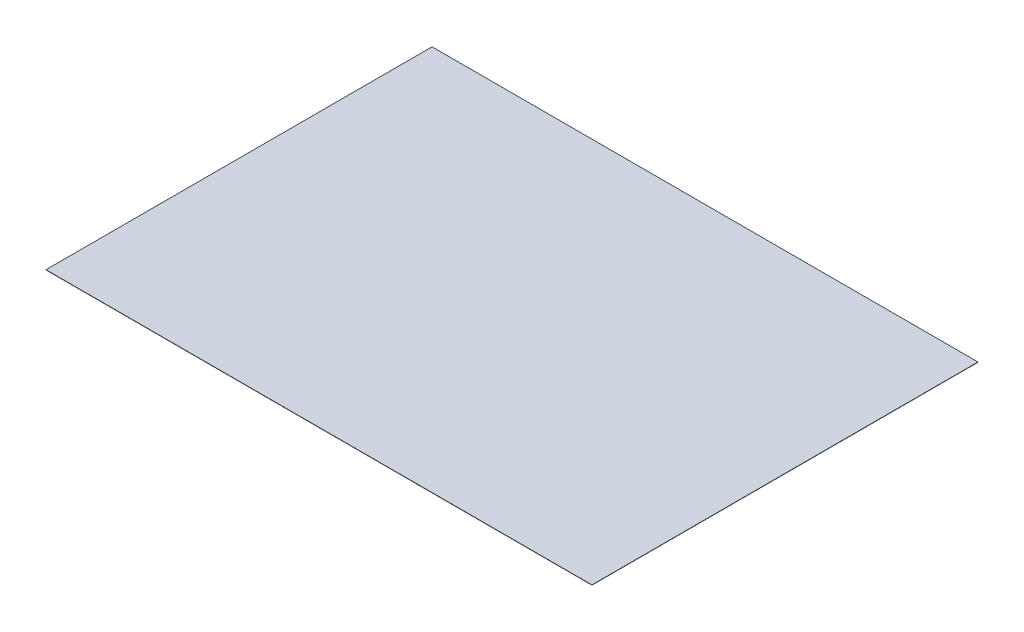
ISO-10303-21;
HEADER;
FILE_DESCRIPTION(('STEP AP214'),'2;1');
FILE_NAME('part.step','',(''),(''),'','','');
FILE_SCHEMA(('AUTOMOTIVE_DESIGN { 1 0 10303 214 1 1 1 1 }'));
ENDSEC;
DATA;
#1=APPLICATION_CONTEXT('core data for automotive mechanical design processes');
#2=APPLICATION_PROTOCOL_DEFINITION('international standard','automotive_design',2000,#1);
#3=PRODUCT_CONTEXT('',#1,'mechanical');
#4=PRODUCT('Part','Part','',(#3));
#5=PRODUCT_RELATED_PRODUCT_CATEGORY('part','',(#4));
#6=PRODUCT_DEFINITION_FORMATION('','',#4);
#7=PRODUCT_DEFINITION_CONTEXT('part definition',#1,'design');
#8=PRODUCT_DEFINITION('design','',#6,#7);
#9=PRODUCT_DEFINITION_SHAPE('','',#8);
#10=(LENGTH_UNIT() NAMED_UNIT(*) SI_UNIT(.MILLI.,.METRE.));
#11=(NAMED_UNIT(*) PLANE_ANGLE_UNIT() SI_UNIT($,.RADIAN.));
#12=(NAMED_UNIT(*) SI_UNIT($,.STERADIAN.) SOLID_ANGLE_UNIT());
#13=UNCERTAINTY_MEASURE_WITH_UNIT(LENGTH_MEASURE(1.E-05),#10,'distance_accuracy_value','');
#14=(GEOMETRIC_REPRESENTATION_CONTEXT(3) GLOBAL_UNCERTAINTY_ASSIGNED_CONTEXT((#13)) GLOBAL_UNIT_ASSIGNED_CONTEXT((#10,
#11,#12)) REPRESENTATION_CONTEXT('',''));
#15=CARTESIAN_POINT('',(0.,0.,0.));
#16=DIRECTION('',(0.,0.,1.));
#17=DIRECTION('',(1.,0.,0.));
#18=AXIS2_PLACEMENT_3D('',#15,#16,#17);
#19=CARTESIAN_POINT('',(210.,0.2,-148.5));
#20=DIRECTION('',(-1.,0.,0.));
#21=DIRECTION('',(0.,0.,1.));
#22=AXIS2_PLACEMENT_3D('',#19,#20,#21);
#23=PLANE('',#22);
#24=DIRECTION('',(0.,0.,-1.));
#25=VECTOR('',#24,1.);
#26=CARTESIAN_POINT('',(210.,0.,-148.5));
#27=LINE('',#26,#25);
#28=CARTESIAN_POINT('',(210.,0.,148.5));
#29=VERTEX_POINT('',#28);
#30=CARTESIAN_POINT('',(210.,0.,-148.5));
#31=VERTEX_POINT('',#30);
#32=EDGE_CURVE('E111',#29,#31,#27,.T.);
#33=ORIENTED_EDGE('',*,*,#32,.T.);
#34=DIRECTION('',(0.,-1.,0.));
#35=VECTOR('',#34,1.);
#36=CARTESIAN_POINT('',(210.,0.2,-148.5));
#37=LINE('',#36,#35);
#38=CARTESIAN_POINT('',(210.,0.2,-148.5));
#39=VERTEX_POINT('',#38);
#40=EDGE_CURVE('E11',#39,#31,#37,.T.);
#41=ORIENTED_EDGE('',*,*,#40,.F.);
#42=DIRECTION('',(0.,0.,-1.));
#43=VECTOR('',#42,1.);
#44=CARTESIAN_POINT('',(210.,0.2,-148.5));
#45=LINE('',#44,#43);
#46=CARTESIAN_POINT('',(210.,0.2,148.5));
#47=VERTEX_POINT('',#46);
#48=EDGE_CURVE('E95',#47,#39,#45,.T.);
#49=ORIENTED_EDGE('',*,*,#48,.F.);
#50=DIRECTION('',(0.,-1.,0.));
#51=VECTOR('',#50,1.);
#52=CARTESIAN_POINT('',(210.,0.2,148.5));
#53=LINE('',#52,#51);
#54=EDGE_CURVE('E107',#47,#29,#53,.T.);
#55=ORIENTED_EDGE('',*,*,#54,.T.);
#56=EDGE_LOOP('',(#33,#41,#49,#55));
#57=FACE_BOUND('',#56,.T.);
#58=ADVANCED_FACE('F43',(#57),#23,.F.);
#59=CARTESIAN_POINT('',(-210.,0.2,-148.5));
#60=DIRECTION('',(0.,0.,1.));
#61=DIRECTION('',(1.,0.,0.));
#62=AXIS2_PLACEMENT_3D('',#59,#60,#61);
#63=PLANE('',#62);
#64=DIRECTION('',(-1.,0.,0.));
#65=VECTOR('',#64,1.);
#66=CARTESIAN_POINT('',(-210.,0.,-148.5));
#67=LINE('',#66,#65);
#68=CARTESIAN_POINT('',(-210.,0.,-148.5));
#69=VERTEX_POINT('',#68);
#70=EDGE_CURVE('E100',#31,#69,#67,.T.);
#71=ORIENTED_EDGE('',*,*,#70,.T.);
#72=DIRECTION('',(0.,-1.,0.));
#73=VECTOR('',#72,1.);
#74=CARTESIAN_POINT('',(-210.,0.2,-148.5));
#75=LINE('',#74,#73);
#76=CARTESIAN_POINT('',(-210.,0.2,-148.5));
#77=VERTEX_POINT('',#76);
#78=EDGE_CURVE('E52',#77,#69,#75,.T.);
#79=ORIENTED_EDGE('',*,*,#78,.F.);
#80=DIRECTION('',(-1.,0.,0.));
#81=VECTOR('',#80,1.);
#82=CARTESIAN_POINT('',(-210.,0.2,-148.5));
#83=LINE('',#82,#81);
#84=EDGE_CURVE('E90',#39,#77,#83,.T.);
#85=ORIENTED_EDGE('',*,*,#84,.F.);
#86=ORIENTED_EDGE('',*,*,#40,.T.);
#87=EDGE_LOOP('',(#71,#79,#85,#86));
#88=FACE_BOUND('',#87,.T.);
#89=ADVANCED_FACE('F99',(#88),#63,.F.);
#90=CARTESIAN_POINT('',(-210.,0.2,-148.5));
#91=DIRECTION('',(1.,0.,0.));
#92=DIRECTION('',(0.,0.,-1.));
#93=AXIS2_PLACEMENT_3D('',#90,#91,#92);
#94=PLANE('',#93);
#95=DIRECTION('',(0.,0.,1.));
#96=VECTOR('',#95,1.);
#97=CARTESIAN_POINT('',(-210.,0.,-148.5));
#98=LINE('',#97,#96);
#99=CARTESIAN_POINT('',(-210.,0.,148.5));
#100=VERTEX_POINT('',#99);
#101=EDGE_CURVE('E77',#69,#100,#98,.T.);
#102=ORIENTED_EDGE('',*,*,#101,.T.);
#103=DIRECTION('',(0.,-1.,0.));
#104=VECTOR('',#103,1.);
#105=CARTESIAN_POINT('',(-210.,0.2,148.5));
#106=LINE('',#105,#104);
#107=CARTESIAN_POINT('',(-210.,0.2,148.5));
#108=VERTEX_POINT('',#107);
#109=EDGE_CURVE('E102',#108,#100,#106,.T.);
#110=ORIENTED_EDGE('',*,*,#109,.F.);
#111=DIRECTION('',(0.,0.,1.));
#112=VECTOR('',#111,1.);
#113=CARTESIAN_POINT('',(-210.,0.2,-148.5));
#114=LINE('',#113,#112);
#115=EDGE_CURVE('E93',#77,#108,#114,.T.);
#116=ORIENTED_EDGE('',*,*,#115,.F.);
#117=ORIENTED_EDGE('',*,*,#78,.T.);
#118=EDGE_LOOP('',(#102,#110,#116,#117));
#119=FACE_BOUND('',#118,.T.);
#120=ADVANCED_FACE('F103',(#119),#94,.F.);
#121=CARTESIAN_POINT('',(-210.,0.2,148.5));
#122=DIRECTION('',(0.,0.,-1.));
#123=DIRECTION('',(-1.,0.,0.));
#124=AXIS2_PLACEMENT_3D('',#121,#122,#123);
#125=PLANE('',#124);
#126=DIRECTION('',(1.,0.,0.));
#127=VECTOR('',#126,1.);
#128=CARTESIAN_POINT('',(-210.,0.,148.5));
#129=LINE('',#128,#127);
#130=EDGE_CURVE('E83',#100,#29,#129,.T.);
#131=ORIENTED_EDGE('',*,*,#130,.T.);
#132=ORIENTED_EDGE('',*,*,#54,.F.);
#133=DIRECTION('',(1.,0.,0.));
#134=VECTOR('',#133,1.);
#135=CARTESIAN_POINT('',(-210.,0.2,148.5));
#136=LINE('',#135,#134);
#137=EDGE_CURVE('E60',#108,#47,#136,.T.);
#138=ORIENTED_EDGE('',*,*,#137,.F.);
#139=ORIENTED_EDGE('',*,*,#109,.T.);
#140=EDGE_LOOP('',(#131,#132,#138,#139));
#141=FACE_BOUND('',#140,.T.);
#142=ADVANCED_FACE('F124',(#141),#125,.F.);
#143=CARTESIAN_POINT('',(0.,0.2,0.));
#144=DIRECTION('',(0.,1.,0.));
#145=DIRECTION('',(0.,0.,1.));
#146=AXIS2_PLACEMENT_3D('',#143,#144,#145);
#147=PLANE('',#146);
#148=ORIENTED_EDGE('',*,*,#48,.T.);
#149=ORIENTED_EDGE('',*,*,#84,.T.);
#150=ORIENTED_EDGE('',*,*,#115,.T.);
#151=ORIENTED_EDGE('',*,*,#137,.T.);
#152=EDGE_LOOP('',(#148,#149,#150,#151));
#153=FACE_BOUND('',#152,.T.);
#154=ADVANCED_FACE('F91',(#153),#147,.T.);
#155=CARTESIAN_POINT('',(0.,0.,0.));
#156=DIRECTION('',(0.,1.,0.));
#157=DIRECTION('',(0.,0.,1.));
#158=AXIS2_PLACEMENT_3D('',#155,#156,#157);
#159=PLANE('',#158);
#160=ORIENTED_EDGE('',*,*,#32,.F.);
#161=ORIENTED_EDGE('',*,*,#130,.F.);
#162=ORIENTED_EDGE('',*,*,#101,.F.);
#163=ORIENTED_EDGE('',*,*,#70,.F.);
#164=EDGE_LOOP('',(#160,#161,#162,#163));
#165=FACE_BOUND('',#164,.T.);
#166=ADVANCED_FACE('F127',(#165),#159,.F.);
#167=CLOSED_SHELL('',(#58,#89,#120,#142,#154,#166));
#168=MANIFOLD_SOLID_BREP('B2',#167);
#169=ADVANCED_BREP_SHAPE_REPRESENTATION('',(#18,#168),#14);
#170=SHAPE_DEFINITION_REPRESENTATION(#9,#169);
ENDSEC;
END-ISO-10303-21;
